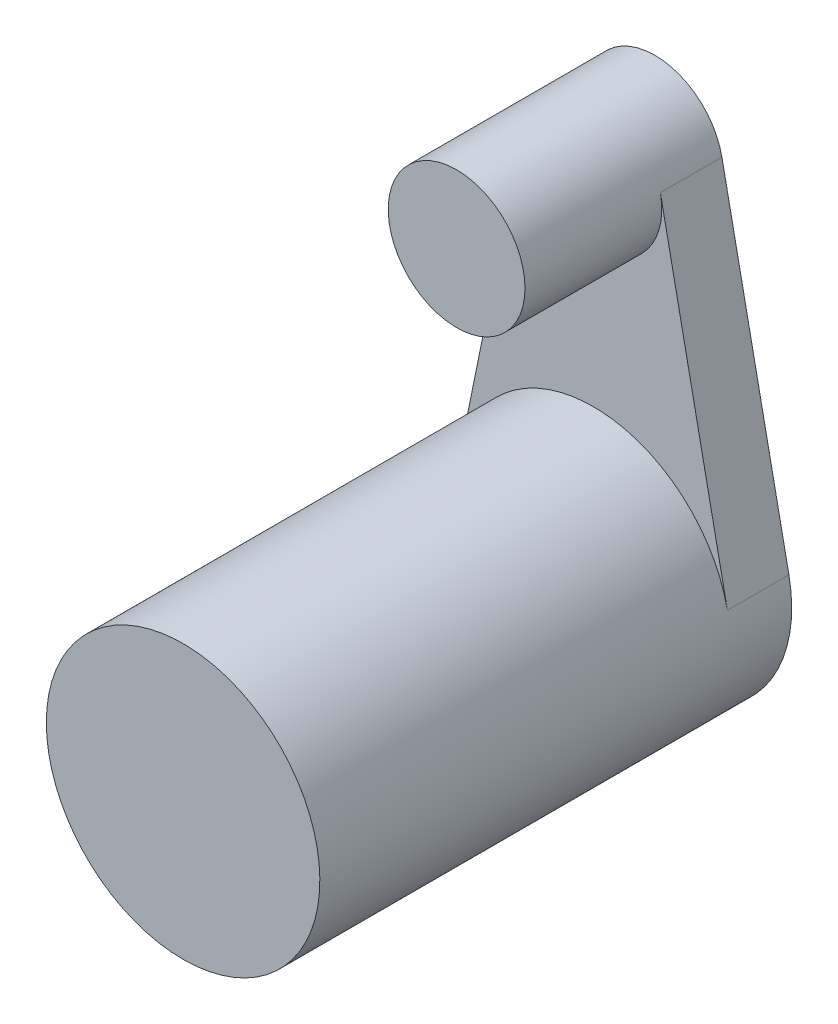
ISO-10303-21;
HEADER;
FILE_DESCRIPTION(('STEP AP214'),'2;1');
FILE_NAME('part.step','',(''),(''),'','','');
FILE_SCHEMA(('AUTOMOTIVE_DESIGN { 1 0 10303 214 1 1 1 1 }'));
ENDSEC;
DATA;
#1=APPLICATION_CONTEXT('core data for automotive mechanical design processes');
#2=APPLICATION_PROTOCOL_DEFINITION('international standard','automotive_design',2000,#1);
#3=PRODUCT_CONTEXT('',#1,'mechanical');
#4=PRODUCT('Part','Part','',(#3));
#5=PRODUCT_RELATED_PRODUCT_CATEGORY('part','',(#4));
#6=PRODUCT_DEFINITION_FORMATION('','',#4);
#7=PRODUCT_DEFINITION_CONTEXT('part definition',#1,'design');
#8=PRODUCT_DEFINITION('design','',#6,#7);
#9=PRODUCT_DEFINITION_SHAPE('','',#8);
#10=(LENGTH_UNIT() NAMED_UNIT(*) SI_UNIT(.MILLI.,.METRE.));
#11=(NAMED_UNIT(*) PLANE_ANGLE_UNIT() SI_UNIT($,.RADIAN.));
#12=(NAMED_UNIT(*) SI_UNIT($,.STERADIAN.) SOLID_ANGLE_UNIT());
#13=UNCERTAINTY_MEASURE_WITH_UNIT(LENGTH_MEASURE(1.E-05),#10,'distance_accuracy_value','');
#14=(GEOMETRIC_REPRESENTATION_CONTEXT(3) GLOBAL_UNCERTAINTY_ASSIGNED_CONTEXT((#13)) GLOBAL_UNIT_ASSIGNED_CONTEXT((#10,
#11,#12)) REPRESENTATION_CONTEXT('',''));
#15=CARTESIAN_POINT('',(0.,0.,0.));
#16=DIRECTION('',(0.,0.,1.));
#17=DIRECTION('',(1.,0.,0.));
#18=AXIS2_PLACEMENT_3D('',#15,#16,#17);
#19=CARTESIAN_POINT('',(0.,0.,2.));
#20=DIRECTION('',(0.,0.,-1.));
#21=DIRECTION('',(-1.,0.,0.));
#22=AXIS2_PLACEMENT_3D('',#19,#20,#21);
#23=CYLINDRICAL_SURFACE('',#22,1.);
#24=CARTESIAN_POINT('',(0.,0.,2.));
#25=DIRECTION('',(0.,0.,1.));
#26=DIRECTION('',(1.,0.,0.));
#27=AXIS2_PLACEMENT_3D('',#24,#25,#26);
#28=CIRCLE('',#27,1.);
#29=CARTESIAN_POINT('',(1.,0.,2.));
#30=VERTEX_POINT('',#29);
#31=EDGE_CURVE('E11',#30,#30,#28,.T.);
#32=ORIENTED_EDGE('',*,*,#31,.F.);
#33=EDGE_LOOP('',(#32));
#34=FACE_BOUND('',#33,.T.);
#35=CARTESIAN_POINT('',(0.,0.,0.));
#36=DIRECTION('',(0.,0.,1.));
#37=DIRECTION('',(1.,0.,0.));
#38=AXIS2_PLACEMENT_3D('',#35,#36,#37);
#39=CIRCLE('',#38,1.);
#40=CARTESIAN_POINT('',(-0.979795897113271,0.2,0.));
#41=VERTEX_POINT('',#40);
#42=CARTESIAN_POINT('',(0.979795897113271,0.2,0.));
#43=VERTEX_POINT('',#42);
#44=EDGE_CURVE('E44',#41,#43,#39,.T.);
#45=ORIENTED_EDGE('',*,*,#44,.T.);
#46=DIRECTION('',(0.,0.,1.));
#47=VECTOR('',#46,1.);
#48=CARTESIAN_POINT('',(0.979795897113271,0.2,-0.9));
#49=LINE('',#48,#47);
#50=CARTESIAN_POINT('',(0.979795897113271,0.2,-0.9));
#51=VERTEX_POINT('',#50);
#52=EDGE_CURVE('E56',#51,#43,#49,.T.);
#53=ORIENTED_EDGE('',*,*,#52,.F.);
#54=CARTESIAN_POINT('',(0.,0.,-0.9));
#55=DIRECTION('',(0.,0.,-1.));
#56=DIRECTION('',(-1.,0.,0.));
#57=AXIS2_PLACEMENT_3D('',#54,#55,#56);
#58=CIRCLE('',#57,1.);
#59=CARTESIAN_POINT('',(-0.979795897113271,0.2,-0.9));
#60=VERTEX_POINT('',#59);
#61=EDGE_CURVE('E119',#60,#51,#58,.T.);
#62=ORIENTED_EDGE('',*,*,#61,.F.);
#63=DIRECTION('',(0.,0.,1.));
#64=VECTOR('',#63,1.);
#65=CARTESIAN_POINT('',(-0.979795897113271,0.2,-0.9));
#66=LINE('',#65,#64);
#67=EDGE_CURVE('E65',#60,#41,#66,.T.);
#68=ORIENTED_EDGE('',*,*,#67,.T.);
#69=EDGE_LOOP('',(#45,#53,#62,#68));
#70=FACE_BOUND('',#69,.T.);
#71=ADVANCED_FACE('F41',(#34,#70),#23,.T.);
#72=CARTESIAN_POINT('',(0.,0.,2.));
#73=DIRECTION('',(0.,0.,1.));
#74=DIRECTION('',(1.,0.,0.));
#75=AXIS2_PLACEMENT_3D('',#72,#73,#74);
#76=PLANE('',#75);
#77=ORIENTED_EDGE('',*,*,#31,.T.);
#78=EDGE_LOOP('',(#77));
#79=FACE_BOUND('',#78,.T.);
#80=ADVANCED_FACE('F143',(#79),#76,.T.);
#81=CARTESIAN_POINT('',(0.979795897113271,0.2,-0.9));
#82=DIRECTION('',(-0.979795897113271,-0.2,0.));
#83=DIRECTION('',(0.2,-0.979795897113271,0.));
#84=AXIS2_PLACEMENT_3D('',#81,#82,#83);
#85=PLANE('',#84);
#86=DIRECTION('',(0.2,-0.979795897113271,0.));
#87=VECTOR('',#86,1.);
#88=CARTESIAN_POINT('',(0.979795897113271,0.2,0.));
#89=LINE('',#88,#87);
#90=CARTESIAN_POINT('',(1.95959179422654,-4.6,0.));
#91=VERTEX_POINT('',#90);
#92=EDGE_CURVE('E90',#43,#91,#89,.T.);
#93=ORIENTED_EDGE('',*,*,#92,.T.);
#94=DIRECTION('',(0.,0.,1.));
#95=VECTOR('',#94,1.);
#96=CARTESIAN_POINT('',(1.95959179422654,-4.6,-0.9));
#97=LINE('',#96,#95);
#98=CARTESIAN_POINT('',(1.95959179422654,-4.6,-0.9));
#99=VERTEX_POINT('',#98);
#100=EDGE_CURVE('E100',#99,#91,#97,.T.);
#101=ORIENTED_EDGE('',*,*,#100,.F.);
#102=DIRECTION('',(0.2,-0.979795897113271,0.));
#103=VECTOR('',#102,1.);
#104=CARTESIAN_POINT('',(0.979795897113271,0.2,-0.9));
#105=LINE('',#104,#103);
#106=EDGE_CURVE('E84',#51,#99,#105,.T.);
#107=ORIENTED_EDGE('',*,*,#106,.F.);
#108=ORIENTED_EDGE('',*,*,#52,.T.);
#109=EDGE_LOOP('',(#93,#101,#107,#108));
#110=FACE_BOUND('',#109,.T.);
#111=ADVANCED_FACE('F99',(#110),#85,.F.);
#112=CARTESIAN_POINT('',(0.,-5.,-0.9));
#113=DIRECTION('',(0.,0.,1.));
#114=DIRECTION('',(1.,0.,0.));
#115=AXIS2_PLACEMENT_3D('',#112,#113,#114);
#116=CYLINDRICAL_SURFACE('',#115,2.);
#117=ORIENTED_EDGE('',*,*,#100,.T.);
#118=CARTESIAN_POINT('',(0.,-5.,0.));
#119=DIRECTION('',(0.,0.,-1.));
#120=DIRECTION('',(-1.,0.,0.));
#121=AXIS2_PLACEMENT_3D('',#118,#119,#120);
#122=CIRCLE('',#121,2.);
#123=CARTESIAN_POINT('',(-1.95959179422654,-4.6,0.));
#124=VERTEX_POINT('',#123);
#125=EDGE_CURVE('E88',#124,#91,#122,.T.);
#126=ORIENTED_EDGE('',*,*,#125,.F.);
#127=DIRECTION('',(0.,0.,1.));
#128=VECTOR('',#127,1.);
#129=CARTESIAN_POINT('',(-1.95959179422654,-4.6,-0.9));
#130=LINE('',#129,#128);
#131=CARTESIAN_POINT('',(-1.95959179422654,-4.6,-0.9));
#132=VERTEX_POINT('',#131);
#133=EDGE_CURVE('E108',#132,#124,#130,.T.);
#134=ORIENTED_EDGE('',*,*,#133,.F.);
#135=CARTESIAN_POINT('',(0.,-5.,-0.9));
#136=DIRECTION('',(0.,0.,-1.));
#137=DIRECTION('',(-1.,0.,0.));
#138=AXIS2_PLACEMENT_3D('',#135,#136,#137);
#139=CIRCLE('',#138,2.);
#140=EDGE_CURVE('E106',#99,#132,#139,.T.);
#141=ORIENTED_EDGE('',*,*,#140,.F.);
#142=EDGE_LOOP('',(#117,#126,#134,#141));
#143=FACE_BOUND('',#142,.T.);
#144=CARTESIAN_POINT('',(0.,-5.,6.));
#145=DIRECTION('',(0.,0.,-1.));
#146=DIRECTION('',(-1.,0.,0.));
#147=AXIS2_PLACEMENT_3D('',#144,#145,#146);
#148=CIRCLE('',#147,2.);
#149=CARTESIAN_POINT('',(-2.,-5.,6.));
#150=VERTEX_POINT('',#149);
#151=EDGE_CURVE('E97',#150,#150,#148,.T.);
#152=ORIENTED_EDGE('',*,*,#151,.T.);
#153=EDGE_LOOP('',(#152));
#154=FACE_BOUND('',#153,.T.);
#155=ADVANCED_FACE('F104',(#143,#154),#116,.T.);
#156=CARTESIAN_POINT('',(-0.979795897113271,0.2,-0.9));
#157=DIRECTION('',(-0.979795897113271,0.2,0.));
#158=DIRECTION('',(-0.2,-0.979795897113271,0.));
#159=AXIS2_PLACEMENT_3D('',#156,#157,#158);
#160=PLANE('',#159);
#161=DIRECTION('',(-0.2,-0.979795897113271,0.));
#162=VECTOR('',#161,1.);
#163=CARTESIAN_POINT('',(-0.979795897113271,0.2,0.));
#164=LINE('',#163,#162);
#165=EDGE_CURVE('E91',#41,#124,#164,.T.);
#166=ORIENTED_EDGE('',*,*,#165,.F.);
#167=ORIENTED_EDGE('',*,*,#67,.F.);
#168=DIRECTION('',(-0.2,-0.979795897113271,0.));
#169=VECTOR('',#168,1.);
#170=CARTESIAN_POINT('',(-0.979795897113271,0.2,-0.9));
#171=LINE('',#170,#169);
#172=EDGE_CURVE('E117',#60,#132,#171,.T.);
#173=ORIENTED_EDGE('',*,*,#172,.T.);
#174=ORIENTED_EDGE('',*,*,#133,.T.);
#175=EDGE_LOOP('',(#166,#167,#173,#174));
#176=FACE_BOUND('',#175,.T.);
#177=ADVANCED_FACE('F153',(#176),#160,.T.);
#178=CARTESIAN_POINT('',(0.,0.,-0.9));
#179=DIRECTION('',(0.,0.,-1.));
#180=DIRECTION('',(-1.,0.,0.));
#181=AXIS2_PLACEMENT_3D('',#178,#179,#180);
#182=PLANE('',#181);
#183=ORIENTED_EDGE('',*,*,#61,.T.);
#184=ORIENTED_EDGE('',*,*,#106,.T.);
#185=ORIENTED_EDGE('',*,*,#140,.T.);
#186=ORIENTED_EDGE('',*,*,#172,.F.);
#187=EDGE_LOOP('',(#183,#184,#185,#186));
#188=FACE_BOUND('',#187,.T.);
#189=ADVANCED_FACE('F139',(#188),#182,.T.);
#190=CARTESIAN_POINT('',(0.,0.,0.));
#191=DIRECTION('',(0.,0.,-1.));
#192=DIRECTION('',(-1.,0.,0.));
#193=AXIS2_PLACEMENT_3D('',#190,#191,#192);
#194=PLANE('',#193);
#195=ORIENTED_EDGE('',*,*,#165,.T.);
#196=ORIENTED_EDGE('',*,*,#125,.T.);
#197=ORIENTED_EDGE('',*,*,#92,.F.);
#198=ORIENTED_EDGE('',*,*,#44,.F.);
#199=EDGE_LOOP('',(#195,#196,#197,#198));
#200=FACE_BOUND('',#199,.T.);
#201=ADVANCED_FACE('F89',(#200),#194,.F.);
#202=CARTESIAN_POINT('',(0.,-5.,6.));
#203=DIRECTION('',(0.,0.,-1.));
#204=DIRECTION('',(-1.,0.,0.));
#205=AXIS2_PLACEMENT_3D('',#202,#203,#204);
#206=PLANE('',#205);
#207=ORIENTED_EDGE('',*,*,#151,.F.);
#208=EDGE_LOOP('',(#207));
#209=FACE_BOUND('',#208,.T.);
#210=ADVANCED_FACE('F133',(#209),#206,.F.);
#211=CLOSED_SHELL('',(#71,#80,#111,#155,#177,#189,#201,#210));
#212=MANIFOLD_SOLID_BREP('B2',#211);
#213=ADVANCED_BREP_SHAPE_REPRESENTATION('',(#18,#212),#14);
#214=SHAPE_DEFINITION_REPRESENTATION(#9,#213);
ENDSEC;
END-ISO-10303-21;
